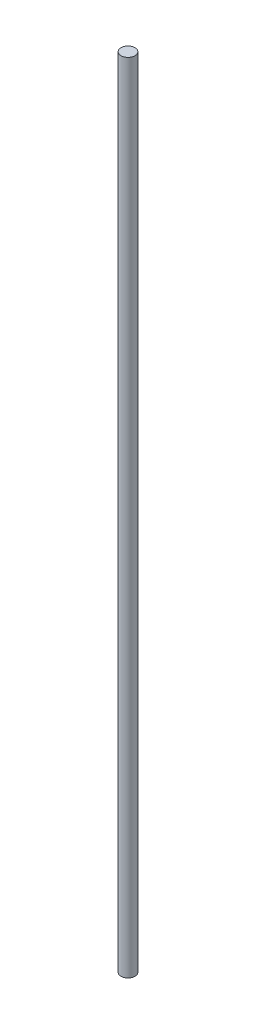
ISO-10303-21;
HEADER;
FILE_DESCRIPTION(('STEP AP214'),'2;1');
FILE_NAME('part.step','',(''),(''),'','','');
FILE_SCHEMA(('AUTOMOTIVE_DESIGN { 1 0 10303 214 1 1 1 1 }'));
ENDSEC;
DATA;
#1=APPLICATION_CONTEXT('core data for automotive mechanical design processes');
#2=APPLICATION_PROTOCOL_DEFINITION('international standard','automotive_design',2000,#1);
#3=PRODUCT_CONTEXT('',#1,'mechanical');
#4=PRODUCT('Part','Part','',(#3));
#5=PRODUCT_RELATED_PRODUCT_CATEGORY('part','',(#4));
#6=PRODUCT_DEFINITION_FORMATION('','',#4);
#7=PRODUCT_DEFINITION_CONTEXT('part definition',#1,'design');
#8=PRODUCT_DEFINITION('design','',#6,#7);
#9=PRODUCT_DEFINITION_SHAPE('','',#8);
#10=(LENGTH_UNIT() NAMED_UNIT(*) SI_UNIT(.MILLI.,.METRE.));
#11=(NAMED_UNIT(*) PLANE_ANGLE_UNIT() SI_UNIT($,.RADIAN.));
#12=(NAMED_UNIT(*) SI_UNIT($,.STERADIAN.) SOLID_ANGLE_UNIT());
#13=UNCERTAINTY_MEASURE_WITH_UNIT(LENGTH_MEASURE(1.E-05),#10,'distance_accuracy_value','');
#14=(GEOMETRIC_REPRESENTATION_CONTEXT(3) GLOBAL_UNCERTAINTY_ASSIGNED_CONTEXT((#13)) GLOBAL_UNIT_ASSIGNED_CONTEXT((#10,
#11,#12)) REPRESENTATION_CONTEXT('',''));
#15=CARTESIAN_POINT('',(0.,0.,0.));
#16=DIRECTION('',(0.,0.,1.));
#17=DIRECTION('',(1.,0.,0.));
#18=AXIS2_PLACEMENT_3D('',#15,#16,#17);
#19=CARTESIAN_POINT('',(0.,457.,0.));
#20=DIRECTION('',(0.,-1.,0.));
#21=DIRECTION('',(0.,0.,-1.));
#22=AXIS2_PLACEMENT_3D('',#19,#20,#21);
#23=CYLINDRICAL_SURFACE('',#22,4.);
#24=CARTESIAN_POINT('',(0.,457.,0.));
#25=DIRECTION('',(0.,1.,0.));
#26=DIRECTION('',(0.,0.,1.));
#27=AXIS2_PLACEMENT_3D('',#24,#25,#26);
#28=CIRCLE('',#27,4.);
#29=CARTESIAN_POINT('',(0.,457.,4.));
#30=VERTEX_POINT('',#29);
#31=EDGE_CURVE('E10',#30,#30,#28,.T.);
#32=ORIENTED_EDGE('',*,*,#31,.F.);
#33=EDGE_LOOP('',(#32));
#34=FACE_BOUND('',#33,.T.);
#35=CARTESIAN_POINT('',(0.,0.,0.));
#36=DIRECTION('',(0.,1.,0.));
#37=DIRECTION('',(0.,0.,1.));
#38=AXIS2_PLACEMENT_3D('',#35,#36,#37);
#39=CIRCLE('',#38,4.);
#40=CARTESIAN_POINT('',(0.,0.,4.));
#41=VERTEX_POINT('',#40);
#42=EDGE_CURVE('E33',#41,#41,#39,.T.);
#43=ORIENTED_EDGE('',*,*,#42,.T.);
#44=EDGE_LOOP('',(#43));
#45=FACE_BOUND('',#44,.T.);
#46=ADVANCED_FACE('F30',(#34,#45),#23,.T.);
#47=CARTESIAN_POINT('',(0.,457.,0.));
#48=DIRECTION('',(0.,1.,0.));
#49=DIRECTION('',(0.,0.,1.));
#50=AXIS2_PLACEMENT_3D('',#47,#48,#49);
#51=PLANE('',#50);
#52=ORIENTED_EDGE('',*,*,#31,.T.);
#53=EDGE_LOOP('',(#52));
#54=FACE_BOUND('',#53,.T.);
#55=ADVANCED_FACE('F45',(#54),#51,.T.);
#56=CARTESIAN_POINT('',(0.,0.,0.));
#57=DIRECTION('',(0.,1.,0.));
#58=DIRECTION('',(0.,0.,1.));
#59=AXIS2_PLACEMENT_3D('',#56,#57,#58);
#60=PLANE('',#59);
#61=ORIENTED_EDGE('',*,*,#42,.F.);
#62=EDGE_LOOP('',(#61));
#63=FACE_BOUND('',#62,.T.);
#64=ADVANCED_FACE('F43',(#63),#60,.F.);
#65=CLOSED_SHELL('',(#46,#55,#64));
#66=MANIFOLD_SOLID_BREP('B2',#65);
#67=ADVANCED_BREP_SHAPE_REPRESENTATION('',(#18,#66),#14);
#68=SHAPE_DEFINITION_REPRESENTATION(#9,#67);
ENDSEC;
END-ISO-10303-21;
